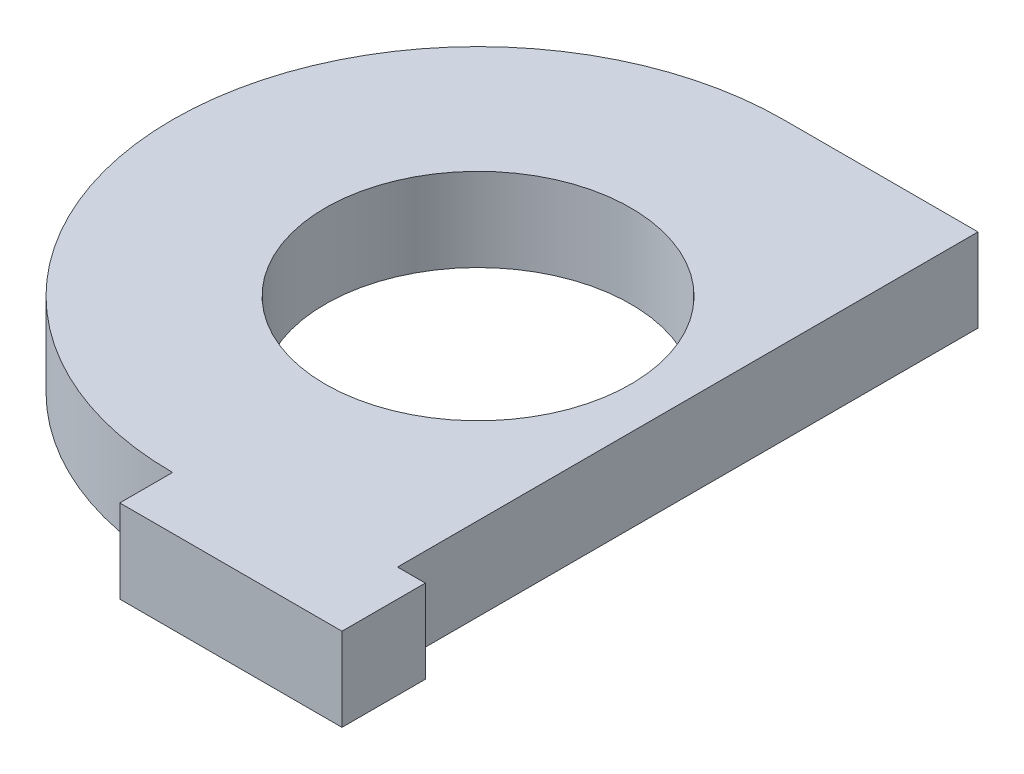
ISO-10303-21;
HEADER;
FILE_DESCRIPTION(('STEP AP214'),'2;1');
FILE_NAME('part.step','',(''),(''),'','','');
FILE_SCHEMA(('AUTOMOTIVE_DESIGN { 1 0 10303 214 1 1 1 1 }'));
ENDSEC;
DATA;
#1=APPLICATION_CONTEXT('core data for automotive mechanical design processes');
#2=APPLICATION_PROTOCOL_DEFINITION('international standard','automotive_design',2000,#1);
#3=PRODUCT_CONTEXT('',#1,'mechanical');
#4=PRODUCT('Part','Part','',(#3));
#5=PRODUCT_RELATED_PRODUCT_CATEGORY('part','',(#4));
#6=PRODUCT_DEFINITION_FORMATION('','',#4);
#7=PRODUCT_DEFINITION_CONTEXT('part definition',#1,'design');
#8=PRODUCT_DEFINITION('design','',#6,#7);
#9=PRODUCT_DEFINITION_SHAPE('','',#8);
#10=(LENGTH_UNIT() NAMED_UNIT(*) SI_UNIT(.MILLI.,.METRE.));
#11=(NAMED_UNIT(*) PLANE_ANGLE_UNIT() SI_UNIT($,.RADIAN.));
#12=(NAMED_UNIT(*) SI_UNIT($,.STERADIAN.) SOLID_ANGLE_UNIT());
#13=UNCERTAINTY_MEASURE_WITH_UNIT(LENGTH_MEASURE(1.E-05),#10,'distance_accuracy_value','');
#14=(GEOMETRIC_REPRESENTATION_CONTEXT(3) GLOBAL_UNCERTAINTY_ASSIGNED_CONTEXT((#13)) GLOBAL_UNIT_ASSIGNED_CONTEXT((#10,
#11,#12)) REPRESENTATION_CONTEXT('',''));
#15=CARTESIAN_POINT('',(0.,0.,0.));
#16=DIRECTION('',(0.,0.,1.));
#17=DIRECTION('',(1.,0.,0.));
#18=AXIS2_PLACEMENT_3D('',#15,#16,#17);
#19=CARTESIAN_POINT('',(-14.,6.,-19.8));
#20=DIRECTION('',(0.,1.,0.));
#21=DIRECTION('',(0.,0.,1.));
#22=AXIS2_PLACEMENT_3D('',#19,#20,#21);
#23=PLANE('',#22);
#24=DIRECTION('',(-1.,0.,0.));
#25=VECTOR('',#24,1.);
#26=CARTESIAN_POINT('',(0.,6.,0.));
#27=LINE('',#26,#25);
#28=CARTESIAN_POINT('',(1.99999999999999,6.,0.));
#29=VERTEX_POINT('',#28);
#30=CARTESIAN_POINT('',(0.,6.,0.));
#31=VERTEX_POINT('',#30);
#32=EDGE_CURVE('E136',#29,#31,#27,.T.);
#33=ORIENTED_EDGE('',*,*,#32,.T.);
#34=DIRECTION('',(0.,0.,-1.));
#35=VECTOR('',#34,1.);
#36=CARTESIAN_POINT('',(0.,6.,0.));
#37=LINE('',#36,#35);
#38=CARTESIAN_POINT('',(0.,6.,-41.8));
#39=VERTEX_POINT('',#38);
#40=EDGE_CURVE('E89',#31,#39,#37,.T.);
#41=ORIENTED_EDGE('',*,*,#40,.T.);
#42=DIRECTION('',(-1.,0.,0.));
#43=VECTOR('',#42,1.);
#44=CARTESIAN_POINT('',(0.,6.,-41.8));
#45=LINE('',#44,#43);
#46=CARTESIAN_POINT('',(-14.,6.,-41.8));
#47=VERTEX_POINT('',#46);
#48=EDGE_CURVE('E148',#39,#47,#45,.T.);
#49=ORIENTED_EDGE('',*,*,#48,.T.);
#50=CARTESIAN_POINT('',(-14.,6.,-19.8));
#51=DIRECTION('',(0.,1.,0.));
#52=DIRECTION('',(0.,0.,1.));
#53=AXIS2_PLACEMENT_3D('',#50,#51,#52);
#54=CIRCLE('',#53,22.);
#55=CARTESIAN_POINT('',(-14.,6.,2.2));
#56=VERTEX_POINT('',#55);
#57=EDGE_CURVE('E105',#47,#56,#54,.T.);
#58=ORIENTED_EDGE('',*,*,#57,.T.);
#59=DIRECTION('',(0.,0.,1.));
#60=VECTOR('',#59,1.);
#61=CARTESIAN_POINT('',(-14.,6.,2.2));
#62=LINE('',#61,#60);
#63=CARTESIAN_POINT('',(-14.,6.,6.));
#64=VERTEX_POINT('',#63);
#65=EDGE_CURVE('E99',#56,#64,#62,.T.);
#66=ORIENTED_EDGE('',*,*,#65,.T.);
#67=DIRECTION('',(1.,0.,0.));
#68=VECTOR('',#67,1.);
#69=CARTESIAN_POINT('',(-14.,6.,6.));
#70=LINE('',#69,#68);
#71=CARTESIAN_POINT('',(1.99999999999999,6.,6.));
#72=VERTEX_POINT('',#71);
#73=EDGE_CURVE('E103',#64,#72,#70,.T.);
#74=ORIENTED_EDGE('',*,*,#73,.T.);
#75=DIRECTION('',(0.,0.,-1.));
#76=VECTOR('',#75,1.);
#77=CARTESIAN_POINT('',(1.99999999999999,6.,0.));
#78=LINE('',#77,#76);
#79=EDGE_CURVE('E49',#72,#29,#78,.T.);
#80=ORIENTED_EDGE('',*,*,#79,.T.);
#81=EDGE_LOOP('',(#33,#41,#49,#58,#66,#74,#80));
#82=FACE_BOUND('',#81,.T.);
#83=CARTESIAN_POINT('',(-14.,6.,-19.8));
#84=DIRECTION('',(0.,1.,0.));
#85=DIRECTION('',(0.,0.,1.));
#86=AXIS2_PLACEMENT_3D('',#83,#84,#85);
#87=CIRCLE('',#86,11.);
#88=CARTESIAN_POINT('',(-14.,6.,-8.8));
#89=VERTEX_POINT('',#88);
#90=EDGE_CURVE('E127',#89,#89,#87,.T.);
#91=ORIENTED_EDGE('',*,*,#90,.F.);
#92=EDGE_LOOP('',(#91));
#93=FACE_BOUND('',#92,.T.);
#94=ADVANCED_FACE('F32',(#82,#93),#23,.T.);
#95=CARTESIAN_POINT('',(-14.,0.,-19.8));
#96=DIRECTION('',(0.,1.,0.));
#97=DIRECTION('',(0.,0.,1.));
#98=AXIS2_PLACEMENT_3D('',#95,#96,#97);
#99=PLANE('',#98);
#100=DIRECTION('',(-1.,0.,0.));
#101=VECTOR('',#100,1.);
#102=CARTESIAN_POINT('',(0.,0.,0.));
#103=LINE('',#102,#101);
#104=CARTESIAN_POINT('',(1.99999999999999,0.,0.));
#105=VERTEX_POINT('',#104);
#106=CARTESIAN_POINT('',(0.,0.,0.));
#107=VERTEX_POINT('',#106);
#108=EDGE_CURVE('E123',#105,#107,#103,.T.);
#109=ORIENTED_EDGE('',*,*,#108,.F.);
#110=DIRECTION('',(0.,0.,-1.));
#111=VECTOR('',#110,1.);
#112=CARTESIAN_POINT('',(1.99999999999999,0.,0.));
#113=LINE('',#112,#111);
#114=CARTESIAN_POINT('',(1.99999999999999,0.,6.));
#115=VERTEX_POINT('',#114);
#116=EDGE_CURVE('E81',#115,#105,#113,.T.);
#117=ORIENTED_EDGE('',*,*,#116,.F.);
#118=DIRECTION('',(1.,0.,0.));
#119=VECTOR('',#118,1.);
#120=CARTESIAN_POINT('',(-14.,0.,6.));
#121=LINE('',#120,#119);
#122=CARTESIAN_POINT('',(-14.,0.,6.));
#123=VERTEX_POINT('',#122);
#124=EDGE_CURVE('E75',#123,#115,#121,.T.);
#125=ORIENTED_EDGE('',*,*,#124,.F.);
#126=DIRECTION('',(0.,0.,1.));
#127=VECTOR('',#126,1.);
#128=CARTESIAN_POINT('',(-14.,0.,2.2));
#129=LINE('',#128,#127);
#130=CARTESIAN_POINT('',(-14.,0.,2.2));
#131=VERTEX_POINT('',#130);
#132=EDGE_CURVE('E113',#131,#123,#129,.T.);
#133=ORIENTED_EDGE('',*,*,#132,.F.);
#134=CARTESIAN_POINT('',(-14.,0.,-19.8));
#135=DIRECTION('',(0.,1.,0.));
#136=DIRECTION('',(0.,0.,1.));
#137=AXIS2_PLACEMENT_3D('',#134,#135,#136);
#138=CIRCLE('',#137,22.);
#139=CARTESIAN_POINT('',(-14.,0.,-41.8));
#140=VERTEX_POINT('',#139);
#141=EDGE_CURVE('E131',#140,#131,#138,.T.);
#142=ORIENTED_EDGE('',*,*,#141,.F.);
#143=DIRECTION('',(-1.,0.,0.));
#144=VECTOR('',#143,1.);
#145=CARTESIAN_POINT('',(0.,0.,-41.8));
#146=LINE('',#145,#144);
#147=CARTESIAN_POINT('',(0.,0.,-41.8));
#148=VERTEX_POINT('',#147);
#149=EDGE_CURVE('E129',#148,#140,#146,.T.);
#150=ORIENTED_EDGE('',*,*,#149,.F.);
#151=DIRECTION('',(0.,0.,-1.));
#152=VECTOR('',#151,1.);
#153=CARTESIAN_POINT('',(0.,0.,0.));
#154=LINE('',#153,#152);
#155=EDGE_CURVE('E126',#107,#148,#154,.T.);
#156=ORIENTED_EDGE('',*,*,#155,.F.);
#157=EDGE_LOOP('',(#109,#117,#125,#133,#142,#150,#156));
#158=FACE_BOUND('',#157,.T.);
#159=CARTESIAN_POINT('',(-14.,0.,-19.8));
#160=DIRECTION('',(0.,1.,0.));
#161=DIRECTION('',(0.,0.,1.));
#162=AXIS2_PLACEMENT_3D('',#159,#160,#161);
#163=CIRCLE('',#162,11.);
#164=CARTESIAN_POINT('',(-14.,0.,-8.8));
#165=VERTEX_POINT('',#164);
#166=EDGE_CURVE('E160',#165,#165,#163,.T.);
#167=ORIENTED_EDGE('',*,*,#166,.T.);
#168=EDGE_LOOP('',(#167));
#169=FACE_BOUND('',#168,.T.);
#170=ADVANCED_FACE('F152',(#158,#169),#99,.F.);
#171=CARTESIAN_POINT('',(0.,6.,0.));
#172=DIRECTION('',(0.,0.,1.));
#173=DIRECTION('',(1.,0.,0.));
#174=AXIS2_PLACEMENT_3D('',#171,#172,#173);
#175=PLANE('',#174);
#176=ORIENTED_EDGE('',*,*,#108,.T.);
#177=DIRECTION('',(0.,-1.,0.));
#178=VECTOR('',#177,1.);
#179=CARTESIAN_POINT('',(0.,6.,0.));
#180=LINE('',#179,#178);
#181=EDGE_CURVE('E11',#31,#107,#180,.T.);
#182=ORIENTED_EDGE('',*,*,#181,.F.);
#183=ORIENTED_EDGE('',*,*,#32,.F.);
#184=DIRECTION('',(0.,-1.,0.));
#185=VECTOR('',#184,1.);
#186=CARTESIAN_POINT('',(1.99999999999999,6.,0.));
#187=LINE('',#186,#185);
#188=EDGE_CURVE('E119',#29,#105,#187,.T.);
#189=ORIENTED_EDGE('',*,*,#188,.T.);
#190=EDGE_LOOP('',(#176,#182,#183,#189));
#191=FACE_BOUND('',#190,.T.);
#192=ADVANCED_FACE('F34',(#191),#175,.F.);
#193=CARTESIAN_POINT('',(0.,6.,0.));
#194=DIRECTION('',(-1.,0.,0.));
#195=DIRECTION('',(0.,0.,1.));
#196=AXIS2_PLACEMENT_3D('',#193,#194,#195);
#197=PLANE('',#196);
#198=ORIENTED_EDGE('',*,*,#155,.T.);
#199=DIRECTION('',(0.,-1.,0.));
#200=VECTOR('',#199,1.);
#201=CARTESIAN_POINT('',(0.,6.,-41.8));
#202=LINE('',#201,#200);
#203=EDGE_CURVE('E41',#39,#148,#202,.T.);
#204=ORIENTED_EDGE('',*,*,#203,.F.);
#205=ORIENTED_EDGE('',*,*,#40,.F.);
#206=ORIENTED_EDGE('',*,*,#181,.T.);
#207=EDGE_LOOP('',(#198,#204,#205,#206));
#208=FACE_BOUND('',#207,.T.);
#209=ADVANCED_FACE('F186',(#208),#197,.F.);
#210=CARTESIAN_POINT('',(0.,6.,-41.8));
#211=DIRECTION('',(0.,0.,1.));
#212=DIRECTION('',(1.,0.,0.));
#213=AXIS2_PLACEMENT_3D('',#210,#211,#212);
#214=PLANE('',#213);
#215=ORIENTED_EDGE('',*,*,#149,.T.);
#216=DIRECTION('',(0.,-1.,0.));
#217=VECTOR('',#216,1.);
#218=CARTESIAN_POINT('',(-14.,6.,-41.8));
#219=LINE('',#218,#217);
#220=EDGE_CURVE('E140',#47,#140,#219,.T.);
#221=ORIENTED_EDGE('',*,*,#220,.F.);
#222=ORIENTED_EDGE('',*,*,#48,.F.);
#223=ORIENTED_EDGE('',*,*,#203,.T.);
#224=EDGE_LOOP('',(#215,#221,#222,#223));
#225=FACE_BOUND('',#224,.T.);
#226=ADVANCED_FACE('F146',(#225),#214,.F.);
#227=CARTESIAN_POINT('',(-14.,6.,-19.8));
#228=DIRECTION('',(0.,-1.,0.));
#229=DIRECTION('',(0.,0.,-1.));
#230=AXIS2_PLACEMENT_3D('',#227,#228,#229);
#231=CYLINDRICAL_SURFACE('',#230,22.);
#232=ORIENTED_EDGE('',*,*,#141,.T.);
#233=DIRECTION('',(0.,-1.,0.));
#234=VECTOR('',#233,1.);
#235=CARTESIAN_POINT('',(-14.,6.,2.2));
#236=LINE('',#235,#234);
#237=EDGE_CURVE('E114',#56,#131,#236,.T.);
#238=ORIENTED_EDGE('',*,*,#237,.F.);
#239=ORIENTED_EDGE('',*,*,#57,.F.);
#240=ORIENTED_EDGE('',*,*,#220,.T.);
#241=EDGE_LOOP('',(#232,#238,#239,#240));
#242=FACE_BOUND('',#241,.T.);
#243=ADVANCED_FACE('F155',(#242),#231,.T.);
#244=CARTESIAN_POINT('',(-14.,6.,2.2));
#245=DIRECTION('',(1.,0.,0.));
#246=DIRECTION('',(0.,0.,-1.));
#247=AXIS2_PLACEMENT_3D('',#244,#245,#246);
#248=PLANE('',#247);
#249=ORIENTED_EDGE('',*,*,#132,.T.);
#250=DIRECTION('',(0.,-1.,0.));
#251=VECTOR('',#250,1.);
#252=CARTESIAN_POINT('',(-14.,6.,6.));
#253=LINE('',#252,#251);
#254=EDGE_CURVE('E110',#64,#123,#253,.T.);
#255=ORIENTED_EDGE('',*,*,#254,.F.);
#256=ORIENTED_EDGE('',*,*,#65,.F.);
#257=ORIENTED_EDGE('',*,*,#237,.T.);
#258=EDGE_LOOP('',(#249,#255,#256,#257));
#259=FACE_BOUND('',#258,.T.);
#260=ADVANCED_FACE('F111',(#259),#248,.F.);
#261=CARTESIAN_POINT('',(-14.,6.,6.));
#262=DIRECTION('',(0.,0.,-1.));
#263=DIRECTION('',(-1.,0.,0.));
#264=AXIS2_PLACEMENT_3D('',#261,#262,#263);
#265=PLANE('',#264);
#266=ORIENTED_EDGE('',*,*,#124,.T.);
#267=DIRECTION('',(0.,-1.,0.));
#268=VECTOR('',#267,1.);
#269=CARTESIAN_POINT('',(1.99999999999999,6.,6.));
#270=LINE('',#269,#268);
#271=EDGE_CURVE('E115',#72,#115,#270,.T.);
#272=ORIENTED_EDGE('',*,*,#271,.F.);
#273=ORIENTED_EDGE('',*,*,#73,.F.);
#274=ORIENTED_EDGE('',*,*,#254,.T.);
#275=EDGE_LOOP('',(#266,#272,#273,#274));
#276=FACE_BOUND('',#275,.T.);
#277=ADVANCED_FACE('F117',(#276),#265,.F.);
#278=CARTESIAN_POINT('',(1.99999999999999,6.,0.));
#279=DIRECTION('',(-1.,0.,0.));
#280=DIRECTION('',(0.,0.,1.));
#281=AXIS2_PLACEMENT_3D('',#278,#279,#280);
#282=PLANE('',#281);
#283=ORIENTED_EDGE('',*,*,#116,.T.);
#284=ORIENTED_EDGE('',*,*,#188,.F.);
#285=ORIENTED_EDGE('',*,*,#79,.F.);
#286=ORIENTED_EDGE('',*,*,#271,.T.);
#287=EDGE_LOOP('',(#283,#284,#285,#286));
#288=FACE_BOUND('',#287,.T.);
#289=ADVANCED_FACE('F176',(#288),#282,.F.);
#290=CARTESIAN_POINT('',(-14.,6.,-19.8));
#291=DIRECTION('',(0.,-1.,0.));
#292=DIRECTION('',(0.,0.,-1.));
#293=AXIS2_PLACEMENT_3D('',#290,#291,#292);
#294=CYLINDRICAL_SURFACE('',#293,11.);
#295=ORIENTED_EDGE('',*,*,#90,.T.);
#296=EDGE_LOOP('',(#295));
#297=FACE_BOUND('',#296,.T.);
#298=ORIENTED_EDGE('',*,*,#166,.F.);
#299=EDGE_LOOP('',(#298));
#300=FACE_BOUND('',#299,.T.);
#301=ADVANCED_FACE('F166',(#297,#300),#294,.F.);
#302=CLOSED_SHELL('',(#94,#170,#192,#209,#226,#243,#260,#277,#289,#301));
#303=MANIFOLD_SOLID_BREP('B2',#302);
#304=ADVANCED_BREP_SHAPE_REPRESENTATION('',(#18,#303),#14);
#305=SHAPE_DEFINITION_REPRESENTATION(#9,#304);
ENDSEC;
END-ISO-10303-21;
